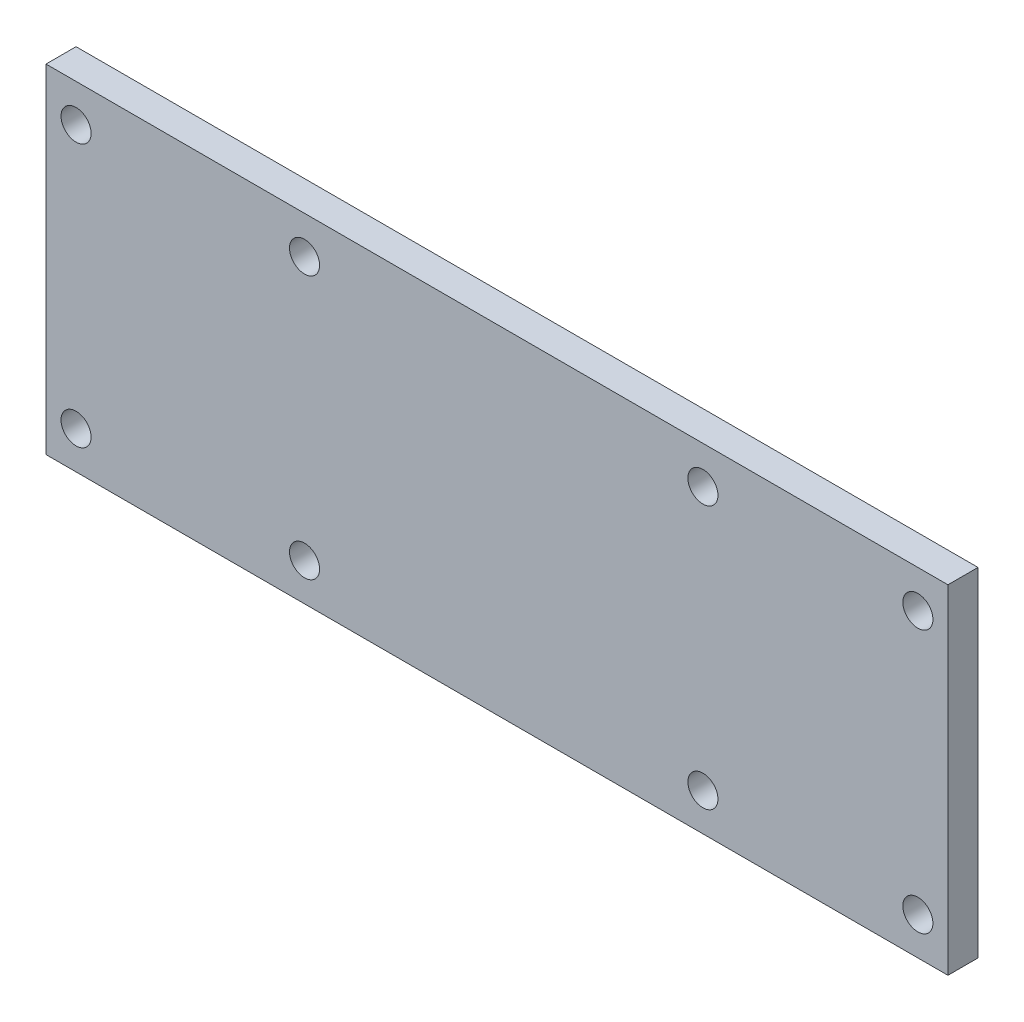
ISO-10303-21;
HEADER;
FILE_DESCRIPTION(('STEP AP214'),'2;1');
FILE_NAME('part.step','',(''),(''),'','','');
FILE_SCHEMA(('AUTOMOTIVE_DESIGN { 1 0 10303 214 1 1 1 1 }'));
ENDSEC;
DATA;
#1=APPLICATION_CONTEXT('core data for automotive mechanical design processes');
#2=APPLICATION_PROTOCOL_DEFINITION('international standard','automotive_design',2000,#1);
#3=PRODUCT_CONTEXT('',#1,'mechanical');
#4=PRODUCT('Part','Part','',(#3));
#5=PRODUCT_RELATED_PRODUCT_CATEGORY('part','',(#4));
#6=PRODUCT_DEFINITION_FORMATION('','',#4);
#7=PRODUCT_DEFINITION_CONTEXT('part definition',#1,'design');
#8=PRODUCT_DEFINITION('design','',#6,#7);
#9=PRODUCT_DEFINITION_SHAPE('','',#8);
#10=(LENGTH_UNIT() NAMED_UNIT(*) SI_UNIT(.MILLI.,.METRE.));
#11=(NAMED_UNIT(*) PLANE_ANGLE_UNIT() SI_UNIT($,.RADIAN.));
#12=(NAMED_UNIT(*) SI_UNIT($,.STERADIAN.) SOLID_ANGLE_UNIT());
#13=UNCERTAINTY_MEASURE_WITH_UNIT(LENGTH_MEASURE(1.E-05),#10,'distance_accuracy_value','');
#14=(GEOMETRIC_REPRESENTATION_CONTEXT(3) GLOBAL_UNCERTAINTY_ASSIGNED_CONTEXT((#13)) GLOBAL_UNIT_ASSIGNED_CONTEXT((#10,
#11,#12)) REPRESENTATION_CONTEXT('',''));
#15=CARTESIAN_POINT('',(0.,0.,0.));
#16=DIRECTION('',(0.,0.,1.));
#17=DIRECTION('',(1.,0.,0.));
#18=AXIS2_PLACEMENT_3D('',#15,#16,#17);
#19=CARTESIAN_POINT('',(0.,0.,4.));
#20=DIRECTION('',(0.,0.,1.));
#21=DIRECTION('',(1.,0.,0.));
#22=AXIS2_PLACEMENT_3D('',#19,#20,#21);
#23=PLANE('',#22);
#24=CARTESIAN_POINT('',(56.0000000000007,17.5000000000043,4.));
#25=DIRECTION('',(0.,0.,1.));
#26=DIRECTION('',(1.,0.,0.));
#27=AXIS2_PLACEMENT_3D('',#24,#25,#26);
#28=CIRCLE('',#27,2.);
#29=CARTESIAN_POINT('',(58.0000000000007,17.5000000000043,4.));
#30=VERTEX_POINT('',#29);
#31=EDGE_CURVE('E145',#30,#30,#28,.T.);
#32=ORIENTED_EDGE('',*,*,#31,.F.);
#33=EDGE_LOOP('',(#32));
#34=FACE_BOUND('',#33,.T.);
#35=CARTESIAN_POINT('',(-25.5999999999999,17.5000000000042,4.));
#36=DIRECTION('',(0.,0.,1.));
#37=DIRECTION('',(1.,0.,0.));
#38=AXIS2_PLACEMENT_3D('',#35,#36,#37);
#39=CIRCLE('',#38,2.);
#40=CARTESIAN_POINT('',(-23.5999999999999,17.5000000000042,4.));
#41=VERTEX_POINT('',#40);
#42=EDGE_CURVE('E133',#41,#41,#39,.T.);
#43=ORIENTED_EDGE('',*,*,#42,.F.);
#44=EDGE_LOOP('',(#43));
#45=FACE_BOUND('',#44,.T.);
#46=CARTESIAN_POINT('',(-25.5999999999999,-17.5,4.));
#47=DIRECTION('',(0.,0.,1.));
#48=DIRECTION('',(1.,0.,0.));
#49=AXIS2_PLACEMENT_3D('',#46,#47,#48);
#50=CIRCLE('',#49,2.);
#51=CARTESIAN_POINT('',(-23.5999999999999,-17.5,4.));
#52=VERTEX_POINT('',#51);
#53=EDGE_CURVE('E121',#52,#52,#50,.T.);
#54=ORIENTED_EDGE('',*,*,#53,.F.);
#55=EDGE_LOOP('',(#54));
#56=FACE_BOUND('',#55,.T.);
#57=CARTESIAN_POINT('',(56.,-17.5,4.));
#58=DIRECTION('',(0.,0.,1.));
#59=DIRECTION('',(1.,0.,0.));
#60=AXIS2_PLACEMENT_3D('',#57,#58,#59);
#61=CIRCLE('',#60,2.);
#62=CARTESIAN_POINT('',(58.,-17.5,4.));
#63=VERTEX_POINT('',#62);
#64=EDGE_CURVE('E100',#63,#63,#61,.T.);
#65=ORIENTED_EDGE('',*,*,#64,.F.);
#66=EDGE_LOOP('',(#65));
#67=FACE_BOUND('',#66,.T.);
#68=DIRECTION('',(0.,1.,0.));
#69=VECTOR('',#68,1.);
#70=CARTESIAN_POINT('',(60.,22.5,4.));
#71=LINE('',#70,#69);
#72=CARTESIAN_POINT('',(60.,-22.5,4.));
#73=VERTEX_POINT('',#72);
#74=CARTESIAN_POINT('',(60.,22.5,4.));
#75=VERTEX_POINT('',#74);
#76=EDGE_CURVE('E85',#73,#75,#71,.T.);
#77=ORIENTED_EDGE('',*,*,#76,.T.);
#78=DIRECTION('',(-1.,0.,0.));
#79=VECTOR('',#78,1.);
#80=CARTESIAN_POINT('',(-60.,22.5,4.));
#81=LINE('',#80,#79);
#82=CARTESIAN_POINT('',(-60.,22.5,4.));
#83=VERTEX_POINT('',#82);
#84=EDGE_CURVE('E80',#75,#83,#81,.T.);
#85=ORIENTED_EDGE('',*,*,#84,.T.);
#86=DIRECTION('',(0.,-1.,0.));
#87=VECTOR('',#86,1.);
#88=CARTESIAN_POINT('',(-60.,22.5,4.));
#89=LINE('',#88,#87);
#90=CARTESIAN_POINT('',(-60.,-22.5,4.));
#91=VERTEX_POINT('',#90);
#92=EDGE_CURVE('E83',#83,#91,#89,.T.);
#93=ORIENTED_EDGE('',*,*,#92,.T.);
#94=DIRECTION('',(1.,0.,0.));
#95=VECTOR('',#94,1.);
#96=CARTESIAN_POINT('',(-60.,-22.5,4.));
#97=LINE('',#96,#95);
#98=EDGE_CURVE('E50',#91,#73,#97,.T.);
#99=ORIENTED_EDGE('',*,*,#98,.T.);
#100=EDGE_LOOP('',(#77,#85,#93,#99));
#101=FACE_BOUND('',#100,.T.);
#102=CARTESIAN_POINT('',(27.4000000000065,-17.5,4.));
#103=DIRECTION('',(0.,0.,1.));
#104=DIRECTION('',(1.,0.,0.));
#105=AXIS2_PLACEMENT_3D('',#102,#103,#104);
#106=CIRCLE('',#105,2.);
#107=CARTESIAN_POINT('',(29.4000000000065,-17.5,4.));
#108=VERTEX_POINT('',#107);
#109=EDGE_CURVE('E115',#108,#108,#106,.T.);
#110=ORIENTED_EDGE('',*,*,#109,.F.);
#111=EDGE_LOOP('',(#110));
#112=FACE_BOUND('',#111,.T.);
#113=CARTESIAN_POINT('',(-56.,-17.5,4.));
#114=DIRECTION('',(0.,0.,1.));
#115=DIRECTION('',(1.,0.,0.));
#116=AXIS2_PLACEMENT_3D('',#113,#114,#115);
#117=CIRCLE('',#116,2.00000000000001);
#118=CARTESIAN_POINT('',(-54.,-17.5,4.));
#119=VERTEX_POINT('',#118);
#120=EDGE_CURVE('E127',#119,#119,#117,.T.);
#121=ORIENTED_EDGE('',*,*,#120,.F.);
#122=EDGE_LOOP('',(#121));
#123=FACE_BOUND('',#122,.T.);
#124=CARTESIAN_POINT('',(27.4000000000066,17.5000000000042,4.));
#125=DIRECTION('',(0.,0.,1.));
#126=DIRECTION('',(1.,0.,0.));
#127=AXIS2_PLACEMENT_3D('',#124,#125,#126);
#128=CIRCLE('',#127,2.);
#129=CARTESIAN_POINT('',(29.4000000000066,17.5000000000042,4.));
#130=VERTEX_POINT('',#129);
#131=EDGE_CURVE('E139',#130,#130,#128,.T.);
#132=ORIENTED_EDGE('',*,*,#131,.F.);
#133=EDGE_LOOP('',(#132));
#134=FACE_BOUND('',#133,.T.);
#135=CARTESIAN_POINT('',(-55.9999999999999,17.5000000000042,4.));
#136=DIRECTION('',(0.,0.,1.));
#137=DIRECTION('',(1.,0.,0.));
#138=AXIS2_PLACEMENT_3D('',#135,#136,#137);
#139=CIRCLE('',#138,2.);
#140=CARTESIAN_POINT('',(-53.9999999999999,17.5000000000042,4.));
#141=VERTEX_POINT('',#140);
#142=EDGE_CURVE('E151',#141,#141,#139,.T.);
#143=ORIENTED_EDGE('',*,*,#142,.F.);
#144=EDGE_LOOP('',(#143));
#145=FACE_BOUND('',#144,.T.);
#146=ADVANCED_FACE('F33',(#34,#45,#56,#67,#101,#112,#123,#134,#145),#23,.T.);
#147=CARTESIAN_POINT('',(0.,0.,0.));
#148=DIRECTION('',(0.,0.,1.));
#149=DIRECTION('',(1.,0.,0.));
#150=AXIS2_PLACEMENT_3D('',#147,#148,#149);
#151=PLANE('',#150);
#152=DIRECTION('',(0.,1.,0.));
#153=VECTOR('',#152,1.);
#154=CARTESIAN_POINT('',(60.,22.5,0.));
#155=LINE('',#154,#153);
#156=CARTESIAN_POINT('',(60.,-22.5,0.));
#157=VERTEX_POINT('',#156);
#158=CARTESIAN_POINT('',(60.,22.5,0.));
#159=VERTEX_POINT('',#158);
#160=EDGE_CURVE('E97',#157,#159,#155,.T.);
#161=ORIENTED_EDGE('',*,*,#160,.F.);
#162=DIRECTION('',(1.,0.,0.));
#163=VECTOR('',#162,1.);
#164=CARTESIAN_POINT('',(-60.,-22.5,0.));
#165=LINE('',#164,#163);
#166=CARTESIAN_POINT('',(-60.,-22.5,0.));
#167=VERTEX_POINT('',#166);
#168=EDGE_CURVE('E73',#167,#157,#165,.T.);
#169=ORIENTED_EDGE('',*,*,#168,.F.);
#170=DIRECTION('',(0.,-1.,0.));
#171=VECTOR('',#170,1.);
#172=CARTESIAN_POINT('',(-60.,22.5,0.));
#173=LINE('',#172,#171);
#174=CARTESIAN_POINT('',(-60.,22.5,0.));
#175=VERTEX_POINT('',#174);
#176=EDGE_CURVE('E67',#175,#167,#173,.T.);
#177=ORIENTED_EDGE('',*,*,#176,.F.);
#178=DIRECTION('',(-1.,0.,0.));
#179=VECTOR('',#178,1.);
#180=CARTESIAN_POINT('',(-60.,22.5,0.));
#181=LINE('',#180,#179);
#182=EDGE_CURVE('E89',#159,#175,#181,.T.);
#183=ORIENTED_EDGE('',*,*,#182,.F.);
#184=EDGE_LOOP('',(#161,#169,#177,#183));
#185=FACE_BOUND('',#184,.T.);
#186=CARTESIAN_POINT('',(56.,-17.5,0.));
#187=DIRECTION('',(0.,0.,1.));
#188=DIRECTION('',(1.,0.,0.));
#189=AXIS2_PLACEMENT_3D('',#186,#187,#188);
#190=CIRCLE('',#189,2.);
#191=CARTESIAN_POINT('',(58.,-17.5,0.));
#192=VERTEX_POINT('',#191);
#193=EDGE_CURVE('E112',#192,#192,#190,.T.);
#194=ORIENTED_EDGE('',*,*,#193,.T.);
#195=EDGE_LOOP('',(#194));
#196=FACE_BOUND('',#195,.T.);
#197=CARTESIAN_POINT('',(27.4000000000065,-17.5,0.));
#198=DIRECTION('',(0.,0.,1.));
#199=DIRECTION('',(1.,0.,0.));
#200=AXIS2_PLACEMENT_3D('',#197,#198,#199);
#201=CIRCLE('',#200,2.);
#202=CARTESIAN_POINT('',(29.4000000000065,-17.5,0.));
#203=VERTEX_POINT('',#202);
#204=EDGE_CURVE('E118',#203,#203,#201,.T.);
#205=ORIENTED_EDGE('',*,*,#204,.T.);
#206=EDGE_LOOP('',(#205));
#207=FACE_BOUND('',#206,.T.);
#208=CARTESIAN_POINT('',(-25.5999999999999,-17.5,0.));
#209=DIRECTION('',(0.,0.,1.));
#210=DIRECTION('',(1.,0.,0.));
#211=AXIS2_PLACEMENT_3D('',#208,#209,#210);
#212=CIRCLE('',#211,2.);
#213=CARTESIAN_POINT('',(-23.5999999999999,-17.5,0.));
#214=VERTEX_POINT('',#213);
#215=EDGE_CURVE('E124',#214,#214,#212,.T.);
#216=ORIENTED_EDGE('',*,*,#215,.T.);
#217=EDGE_LOOP('',(#216));
#218=FACE_BOUND('',#217,.T.);
#219=CARTESIAN_POINT('',(-56.,-17.5,0.));
#220=DIRECTION('',(0.,0.,1.));
#221=DIRECTION('',(1.,0.,0.));
#222=AXIS2_PLACEMENT_3D('',#219,#220,#221);
#223=CIRCLE('',#222,2.00000000000001);
#224=CARTESIAN_POINT('',(-54.,-17.5,0.));
#225=VERTEX_POINT('',#224);
#226=EDGE_CURVE('E130',#225,#225,#223,.T.);
#227=ORIENTED_EDGE('',*,*,#226,.T.);
#228=EDGE_LOOP('',(#227));
#229=FACE_BOUND('',#228,.T.);
#230=CARTESIAN_POINT('',(-25.5999999999999,17.5000000000042,0.));
#231=DIRECTION('',(0.,0.,1.));
#232=DIRECTION('',(1.,0.,0.));
#233=AXIS2_PLACEMENT_3D('',#230,#231,#232);
#234=CIRCLE('',#233,2.);
#235=CARTESIAN_POINT('',(-23.5999999999999,17.5000000000042,0.));
#236=VERTEX_POINT('',#235);
#237=EDGE_CURVE('E136',#236,#236,#234,.T.);
#238=ORIENTED_EDGE('',*,*,#237,.T.);
#239=EDGE_LOOP('',(#238));
#240=FACE_BOUND('',#239,.T.);
#241=CARTESIAN_POINT('',(27.4000000000066,17.5000000000042,0.));
#242=DIRECTION('',(0.,0.,1.));
#243=DIRECTION('',(1.,0.,0.));
#244=AXIS2_PLACEMENT_3D('',#241,#242,#243);
#245=CIRCLE('',#244,2.);
#246=CARTESIAN_POINT('',(29.4000000000066,17.5000000000042,0.));
#247=VERTEX_POINT('',#246);
#248=EDGE_CURVE('E142',#247,#247,#245,.T.);
#249=ORIENTED_EDGE('',*,*,#248,.T.);
#250=EDGE_LOOP('',(#249));
#251=FACE_BOUND('',#250,.T.);
#252=CARTESIAN_POINT('',(56.0000000000007,17.5000000000043,0.));
#253=DIRECTION('',(0.,0.,1.));
#254=DIRECTION('',(1.,0.,0.));
#255=AXIS2_PLACEMENT_3D('',#252,#253,#254);
#256=CIRCLE('',#255,2.);
#257=CARTESIAN_POINT('',(58.0000000000007,17.5000000000043,0.));
#258=VERTEX_POINT('',#257);
#259=EDGE_CURVE('E148',#258,#258,#256,.T.);
#260=ORIENTED_EDGE('',*,*,#259,.T.);
#261=EDGE_LOOP('',(#260));
#262=FACE_BOUND('',#261,.T.);
#263=CARTESIAN_POINT('',(-55.9999999999999,17.5000000000042,0.));
#264=DIRECTION('',(0.,0.,1.));
#265=DIRECTION('',(1.,0.,0.));
#266=AXIS2_PLACEMENT_3D('',#263,#264,#265);
#267=CIRCLE('',#266,2.);
#268=CARTESIAN_POINT('',(-53.9999999999999,17.5000000000042,0.));
#269=VERTEX_POINT('',#268);
#270=EDGE_CURVE('E154',#269,#269,#267,.T.);
#271=ORIENTED_EDGE('',*,*,#270,.T.);
#272=EDGE_LOOP('',(#271));
#273=FACE_BOUND('',#272,.T.);
#274=ADVANCED_FACE('F108',(#185,#196,#207,#218,#229,#240,#251,#262,#273),#151,.F.);
#275=CARTESIAN_POINT('',(60.,22.5,4.));
#276=DIRECTION('',(-1.,0.,0.));
#277=DIRECTION('',(0.,0.,1.));
#278=AXIS2_PLACEMENT_3D('',#275,#276,#277);
#279=PLANE('',#278);
#280=ORIENTED_EDGE('',*,*,#160,.T.);
#281=DIRECTION('',(0.,0.,-1.));
#282=VECTOR('',#281,1.);
#283=CARTESIAN_POINT('',(60.,22.5,4.));
#284=LINE('',#283,#282);
#285=EDGE_CURVE('E11',#75,#159,#284,.T.);
#286=ORIENTED_EDGE('',*,*,#285,.F.);
#287=ORIENTED_EDGE('',*,*,#76,.F.);
#288=DIRECTION('',(0.,0.,-1.));
#289=VECTOR('',#288,1.);
#290=CARTESIAN_POINT('',(60.,-22.5,4.));
#291=LINE('',#290,#289);
#292=EDGE_CURVE('E93',#73,#157,#291,.T.);
#293=ORIENTED_EDGE('',*,*,#292,.T.);
#294=EDGE_LOOP('',(#280,#286,#287,#293));
#295=FACE_BOUND('',#294,.T.);
#296=ADVANCED_FACE('F35',(#295),#279,.F.);
#297=CARTESIAN_POINT('',(-60.,22.5,4.));
#298=DIRECTION('',(0.,-1.,0.));
#299=DIRECTION('',(0.,0.,-1.));
#300=AXIS2_PLACEMENT_3D('',#297,#298,#299);
#301=PLANE('',#300);
#302=ORIENTED_EDGE('',*,*,#182,.T.);
#303=DIRECTION('',(0.,0.,-1.));
#304=VECTOR('',#303,1.);
#305=CARTESIAN_POINT('',(-60.,22.5,4.));
#306=LINE('',#305,#304);
#307=EDGE_CURVE('E42',#83,#175,#306,.T.);
#308=ORIENTED_EDGE('',*,*,#307,.F.);
#309=ORIENTED_EDGE('',*,*,#84,.F.);
#310=ORIENTED_EDGE('',*,*,#285,.T.);
#311=EDGE_LOOP('',(#302,#308,#309,#310));
#312=FACE_BOUND('',#311,.T.);
#313=ADVANCED_FACE('F88',(#312),#301,.F.);
#314=CARTESIAN_POINT('',(-60.,22.5,4.));
#315=DIRECTION('',(1.,0.,0.));
#316=DIRECTION('',(0.,0.,-1.));
#317=AXIS2_PLACEMENT_3D('',#314,#315,#316);
#318=PLANE('',#317);
#319=ORIENTED_EDGE('',*,*,#176,.T.);
#320=DIRECTION('',(0.,0.,-1.));
#321=VECTOR('',#320,1.);
#322=CARTESIAN_POINT('',(-60.,-22.5,4.));
#323=LINE('',#322,#321);
#324=EDGE_CURVE('E90',#91,#167,#323,.T.);
#325=ORIENTED_EDGE('',*,*,#324,.F.);
#326=ORIENTED_EDGE('',*,*,#92,.F.);
#327=ORIENTED_EDGE('',*,*,#307,.T.);
#328=EDGE_LOOP('',(#319,#325,#326,#327));
#329=FACE_BOUND('',#328,.T.);
#330=ADVANCED_FACE('F91',(#329),#318,.F.);
#331=CARTESIAN_POINT('',(-60.,-22.5,4.));
#332=DIRECTION('',(0.,1.,0.));
#333=DIRECTION('',(0.,0.,1.));
#334=AXIS2_PLACEMENT_3D('',#331,#332,#333);
#335=PLANE('',#334);
#336=ORIENTED_EDGE('',*,*,#168,.T.);
#337=ORIENTED_EDGE('',*,*,#292,.F.);
#338=ORIENTED_EDGE('',*,*,#98,.F.);
#339=ORIENTED_EDGE('',*,*,#324,.T.);
#340=EDGE_LOOP('',(#336,#337,#338,#339));
#341=FACE_BOUND('',#340,.T.);
#342=ADVANCED_FACE('F105',(#341),#335,.F.);
#343=CARTESIAN_POINT('',(56.,-17.5,4.));
#344=DIRECTION('',(0.,0.,-1.));
#345=DIRECTION('',(-1.,0.,0.));
#346=AXIS2_PLACEMENT_3D('',#343,#344,#345);
#347=CYLINDRICAL_SURFACE('',#346,2.);
#348=ORIENTED_EDGE('',*,*,#64,.T.);
#349=EDGE_LOOP('',(#348));
#350=FACE_BOUND('',#349,.T.);
#351=ORIENTED_EDGE('',*,*,#193,.F.);
#352=EDGE_LOOP('',(#351));
#353=FACE_BOUND('',#352,.T.);
#354=ADVANCED_FACE('F173',(#350,#353),#347,.F.);
#355=CARTESIAN_POINT('',(27.4000000000065,-17.5,4.));
#356=DIRECTION('',(0.,0.,-1.));
#357=DIRECTION('',(-1.,0.,0.));
#358=AXIS2_PLACEMENT_3D('',#355,#356,#357);
#359=CYLINDRICAL_SURFACE('',#358,2.);
#360=ORIENTED_EDGE('',*,*,#109,.T.);
#361=EDGE_LOOP('',(#360));
#362=FACE_BOUND('',#361,.T.);
#363=ORIENTED_EDGE('',*,*,#204,.F.);
#364=EDGE_LOOP('',(#363));
#365=FACE_BOUND('',#364,.T.);
#366=ADVANCED_FACE('F219',(#362,#365),#359,.F.);
#367=CARTESIAN_POINT('',(-25.5999999999999,-17.5,4.));
#368=DIRECTION('',(0.,0.,-1.));
#369=DIRECTION('',(-1.,0.,0.));
#370=AXIS2_PLACEMENT_3D('',#367,#368,#369);
#371=CYLINDRICAL_SURFACE('',#370,2.);
#372=ORIENTED_EDGE('',*,*,#53,.T.);
#373=EDGE_LOOP('',(#372));
#374=FACE_BOUND('',#373,.T.);
#375=ORIENTED_EDGE('',*,*,#215,.F.);
#376=EDGE_LOOP('',(#375));
#377=FACE_BOUND('',#376,.T.);
#378=ADVANCED_FACE('F227',(#374,#377),#371,.F.);
#379=CARTESIAN_POINT('',(-56.,-17.5,4.));
#380=DIRECTION('',(0.,0.,-1.));
#381=DIRECTION('',(-1.,0.,0.));
#382=AXIS2_PLACEMENT_3D('',#379,#380,#381);
#383=CYLINDRICAL_SURFACE('',#382,2.00000000000001);
#384=ORIENTED_EDGE('',*,*,#120,.T.);
#385=EDGE_LOOP('',(#384));
#386=FACE_BOUND('',#385,.T.);
#387=ORIENTED_EDGE('',*,*,#226,.F.);
#388=EDGE_LOOP('',(#387));
#389=FACE_BOUND('',#388,.T.);
#390=ADVANCED_FACE('F235',(#386,#389),#383,.F.);
#391=CARTESIAN_POINT('',(-25.5999999999999,17.5000000000042,4.));
#392=DIRECTION('',(0.,0.,-1.));
#393=DIRECTION('',(-1.,0.,0.));
#394=AXIS2_PLACEMENT_3D('',#391,#392,#393);
#395=CYLINDRICAL_SURFACE('',#394,2.);
#396=ORIENTED_EDGE('',*,*,#42,.T.);
#397=EDGE_LOOP('',(#396));
#398=FACE_BOUND('',#397,.T.);
#399=ORIENTED_EDGE('',*,*,#237,.F.);
#400=EDGE_LOOP('',(#399));
#401=FACE_BOUND('',#400,.T.);
#402=ADVANCED_FACE('F244',(#398,#401),#395,.F.);
#403=CARTESIAN_POINT('',(27.4000000000066,17.5000000000042,4.));
#404=DIRECTION('',(0.,0.,-1.));
#405=DIRECTION('',(-1.,0.,0.));
#406=AXIS2_PLACEMENT_3D('',#403,#404,#405);
#407=CYLINDRICAL_SURFACE('',#406,2.);
#408=ORIENTED_EDGE('',*,*,#131,.T.);
#409=EDGE_LOOP('',(#408));
#410=FACE_BOUND('',#409,.T.);
#411=ORIENTED_EDGE('',*,*,#248,.F.);
#412=EDGE_LOOP('',(#411));
#413=FACE_BOUND('',#412,.T.);
#414=ADVANCED_FACE('F253',(#410,#413),#407,.F.);
#415=CARTESIAN_POINT('',(56.0000000000007,17.5000000000043,4.));
#416=DIRECTION('',(0.,0.,-1.));
#417=DIRECTION('',(-1.,0.,0.));
#418=AXIS2_PLACEMENT_3D('',#415,#416,#417);
#419=CYLINDRICAL_SURFACE('',#418,2.);
#420=ORIENTED_EDGE('',*,*,#31,.T.);
#421=EDGE_LOOP('',(#420));
#422=FACE_BOUND('',#421,.T.);
#423=ORIENTED_EDGE('',*,*,#259,.F.);
#424=EDGE_LOOP('',(#423));
#425=FACE_BOUND('',#424,.T.);
#426=ADVANCED_FACE('F262',(#422,#425),#419,.F.);
#427=CARTESIAN_POINT('',(-55.9999999999999,17.5000000000042,4.));
#428=DIRECTION('',(0.,0.,-1.));
#429=DIRECTION('',(-1.,0.,0.));
#430=AXIS2_PLACEMENT_3D('',#427,#428,#429);
#431=CYLINDRICAL_SURFACE('',#430,2.);
#432=ORIENTED_EDGE('',*,*,#142,.T.);
#433=EDGE_LOOP('',(#432));
#434=FACE_BOUND('',#433,.T.);
#435=ORIENTED_EDGE('',*,*,#270,.F.);
#436=EDGE_LOOP('',(#435));
#437=FACE_BOUND('',#436,.T.);
#438=ADVANCED_FACE('F160',(#434,#437),#431,.F.);
#439=CLOSED_SHELL('',(#146,#274,#296,#313,#330,#342,#354,#366,#378,#390,#402,#414,#426,#438));
#440=MANIFOLD_SOLID_BREP('B2',#439);
#441=ADVANCED_BREP_SHAPE_REPRESENTATION('',(#18,#440),#14);
#442=SHAPE_DEFINITION_REPRESENTATION(#9,#441);
ENDSEC;
END-ISO-10303-21;
